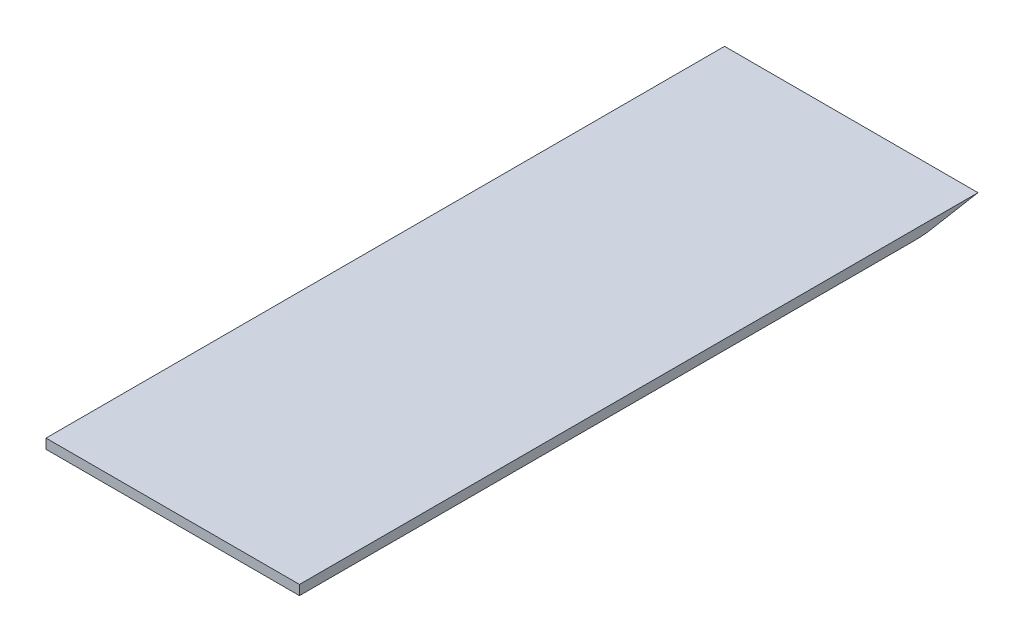
ISO-10303-21;
HEADER;
FILE_DESCRIPTION(('STEP AP214'),'2;1');
FILE_NAME('part.step','',(''),(''),'','','');
FILE_SCHEMA(('AUTOMOTIVE_DESIGN { 1 0 10303 214 1 1 1 1 }'));
ENDSEC;
DATA;
#1=APPLICATION_CONTEXT('core data for automotive mechanical design processes');
#2=APPLICATION_PROTOCOL_DEFINITION('international standard','automotive_design',2000,#1);
#3=PRODUCT_CONTEXT('',#1,'mechanical');
#4=PRODUCT('Part','Part','',(#3));
#5=PRODUCT_RELATED_PRODUCT_CATEGORY('part','',(#4));
#6=PRODUCT_DEFINITION_FORMATION('','',#4);
#7=PRODUCT_DEFINITION_CONTEXT('part definition',#1,'design');
#8=PRODUCT_DEFINITION('design','',#6,#7);
#9=PRODUCT_DEFINITION_SHAPE('','',#8);
#10=(LENGTH_UNIT() NAMED_UNIT(*) SI_UNIT(.MILLI.,.METRE.));
#11=(NAMED_UNIT(*) PLANE_ANGLE_UNIT() SI_UNIT($,.RADIAN.));
#12=(NAMED_UNIT(*) SI_UNIT($,.STERADIAN.) SOLID_ANGLE_UNIT());
#13=UNCERTAINTY_MEASURE_WITH_UNIT(LENGTH_MEASURE(1.E-05),#10,'distance_accuracy_value','');
#14=(GEOMETRIC_REPRESENTATION_CONTEXT(3) GLOBAL_UNCERTAINTY_ASSIGNED_CONTEXT((#13)) GLOBAL_UNIT_ASSIGNED_CONTEXT((#10,
#11,#12)) REPRESENTATION_CONTEXT('',''));
#15=CARTESIAN_POINT('',(0.,0.,0.));
#16=DIRECTION('',(0.,0.,1.));
#17=DIRECTION('',(1.,0.,0.));
#18=AXIS2_PLACEMENT_3D('',#15,#16,#17);
#19=CARTESIAN_POINT('',(130.,5.,0.));
#20=DIRECTION('',(0.,1.,0.));
#21=DIRECTION('',(0.,0.,1.));
#22=AXIS2_PLACEMENT_3D('',#19,#20,#21);
#23=PLANE('',#22);
#24=DIRECTION('',(0.,0.,-1.));
#25=VECTOR('',#24,1.);
#26=CARTESIAN_POINT('',(0.,5.,0.));
#27=LINE('',#26,#25);
#28=CARTESIAN_POINT('',(0.,5.,0.));
#29=VERTEX_POINT('',#28);
#30=CARTESIAN_POINT('',(0.,5.,-348.));
#31=VERTEX_POINT('',#30);
#32=EDGE_CURVE('E116',#29,#31,#27,.T.);
#33=ORIENTED_EDGE('',*,*,#32,.F.);
#34=DIRECTION('',(-1.,0.,0.));
#35=VECTOR('',#34,1.);
#36=CARTESIAN_POINT('',(130.,5.,0.));
#37=LINE('',#36,#35);
#38=CARTESIAN_POINT('',(130.,5.,0.));
#39=VERTEX_POINT('',#38);
#40=EDGE_CURVE('E107',#39,#29,#37,.T.);
#41=ORIENTED_EDGE('',*,*,#40,.F.);
#42=DIRECTION('',(0.,0.,-1.));
#43=VECTOR('',#42,1.);
#44=CARTESIAN_POINT('',(130.,5.,0.));
#45=LINE('',#44,#43);
#46=CARTESIAN_POINT('',(130.,5.,-348.));
#47=VERTEX_POINT('',#46);
#48=EDGE_CURVE('E90',#39,#47,#45,.T.);
#49=ORIENTED_EDGE('',*,*,#48,.T.);
#50=DIRECTION('',(-1.,0.,0.));
#51=VECTOR('',#50,1.);
#52=CARTESIAN_POINT('',(130.,5.,-348.));
#53=LINE('',#52,#51);
#54=EDGE_CURVE('E98',#47,#31,#53,.T.);
#55=ORIENTED_EDGE('',*,*,#54,.T.);
#56=EDGE_LOOP('',(#33,#41,#49,#55));
#57=FACE_BOUND('',#56,.T.);
#58=ADVANCED_FACE('F39',(#57),#23,.T.);
#59=CARTESIAN_POINT('',(130.,5.,0.));
#60=DIRECTION('',(0.,0.,-1.));
#61=DIRECTION('',(0.,1.,0.));
#62=AXIS2_PLACEMENT_3D('',#59,#60,#61);
#63=PLANE('',#62);
#64=DIRECTION('',(0.,-1.,0.));
#65=VECTOR('',#64,1.);
#66=CARTESIAN_POINT('',(0.,5.,0.));
#67=LINE('',#66,#65);
#68=CARTESIAN_POINT('',(0.,0.,0.));
#69=VERTEX_POINT('',#68);
#70=EDGE_CURVE('E109',#29,#69,#67,.T.);
#71=ORIENTED_EDGE('',*,*,#70,.T.);
#72=DIRECTION('',(-1.,0.,0.));
#73=VECTOR('',#72,1.);
#74=CARTESIAN_POINT('',(130.,0.,0.));
#75=LINE('',#74,#73);
#76=CARTESIAN_POINT('',(130.,0.,0.));
#77=VERTEX_POINT('',#76);
#78=EDGE_CURVE('E104',#77,#69,#75,.T.);
#79=ORIENTED_EDGE('',*,*,#78,.F.);
#80=DIRECTION('',(0.,-1.,0.));
#81=VECTOR('',#80,1.);
#82=CARTESIAN_POINT('',(130.,5.,0.));
#83=LINE('',#82,#81);
#84=EDGE_CURVE('E105',#39,#77,#83,.T.);
#85=ORIENTED_EDGE('',*,*,#84,.F.);
#86=ORIENTED_EDGE('',*,*,#40,.T.);
#87=EDGE_LOOP('',(#71,#79,#85,#86));
#88=FACE_BOUND('',#87,.T.);
#89=ADVANCED_FACE('F130',(#88),#63,.F.);
#90=CARTESIAN_POINT('',(130.,0.,0.));
#91=DIRECTION('',(0.,1.,0.));
#92=DIRECTION('',(0.,0.,1.));
#93=AXIS2_PLACEMENT_3D('',#90,#91,#92);
#94=PLANE('',#93);
#95=DIRECTION('',(0.,0.,-1.));
#96=VECTOR('',#95,1.);
#97=CARTESIAN_POINT('',(0.,0.,0.));
#98=LINE('',#97,#96);
#99=CARTESIAN_POINT('',(0.,0.,-315.570746933442));
#100=VERTEX_POINT('',#99);
#101=EDGE_CURVE('E111',#69,#100,#98,.T.);
#102=ORIENTED_EDGE('',*,*,#101,.T.);
#103=DIRECTION('',(-1.,0.,0.));
#104=VECTOR('',#103,1.);
#105=CARTESIAN_POINT('',(130.,0.,-315.570746933442));
#106=LINE('',#105,#104);
#107=CARTESIAN_POINT('',(130.,0.,-315.570746933442));
#108=VERTEX_POINT('',#107);
#109=EDGE_CURVE('E47',#100,#108,#106,.F.);
#110=ORIENTED_EDGE('',*,*,#109,.T.);
#111=DIRECTION('',(0.,0.,-1.));
#112=VECTOR('',#111,1.);
#113=CARTESIAN_POINT('',(130.,0.,0.));
#114=LINE('',#113,#112);
#115=EDGE_CURVE('E95',#77,#108,#114,.T.);
#116=ORIENTED_EDGE('',*,*,#115,.F.);
#117=ORIENTED_EDGE('',*,*,#78,.T.);
#118=EDGE_LOOP('',(#102,#110,#116,#117));
#119=FACE_BOUND('',#118,.T.);
#120=ADVANCED_FACE('F131',(#119),#94,.F.);
#121=CARTESIAN_POINT('',(130.,0.,-320.));
#122=DIRECTION('',(0.,0.984427575508482,0.175790638483657));
#123=DIRECTION('',(0.,-0.175790638483657,0.984427575508482));
#124=AXIS2_PLACEMENT_3D('',#121,#122,#123);
#125=PLANE('',#124);
#126=DIRECTION('',(0.,0.175790638483657,-0.984427575508482));
#127=VECTOR('',#126,1.);
#128=CARTESIAN_POINT('',(130.,0.,-320.));
#129=LINE('',#128,#127);
#130=CARTESIAN_POINT('',(130.,0.778621224575906,-324.360278857625));
#131=VERTEX_POINT('',#130);
#132=EDGE_CURVE('E86',#131,#47,#129,.T.);
#133=ORIENTED_EDGE('',*,*,#132,.F.);
#134=DIRECTION('',(-1.,0.,0.));
#135=VECTOR('',#134,1.);
#136=CARTESIAN_POINT('',(130.,0.778621224575907,-324.360278857625));
#137=LINE('',#136,#135);
#138=CARTESIAN_POINT('',(0.,0.778621224575906,-324.360278857625));
#139=VERTEX_POINT('',#138);
#140=EDGE_CURVE('E121',#131,#139,#137,.T.);
#141=ORIENTED_EDGE('',*,*,#140,.T.);
#142=DIRECTION('',(0.,0.175790638483657,-0.984427575508482));
#143=VECTOR('',#142,1.);
#144=CARTESIAN_POINT('',(0.,0.,-320.));
#145=LINE('',#144,#143);
#146=EDGE_CURVE('E100',#139,#31,#145,.T.);
#147=ORIENTED_EDGE('',*,*,#146,.T.);
#148=ORIENTED_EDGE('',*,*,#54,.F.);
#149=EDGE_LOOP('',(#133,#141,#147,#148));
#150=FACE_BOUND('',#149,.T.);
#151=ADVANCED_FACE('F99',(#150),#125,.F.);
#152=CARTESIAN_POINT('',(130.,0.,0.));
#153=DIRECTION('',(-1.,0.,0.));
#154=DIRECTION('',(0.,0.,1.));
#155=AXIS2_PLACEMENT_3D('',#152,#153,#154);
#156=PLANE('',#155);
#157=ORIENTED_EDGE('',*,*,#115,.T.);
#158=CARTESIAN_POINT('',(130.,50.,-315.570746933442));
#159=DIRECTION('',(-1.,0.,0.));
#160=DIRECTION('',(0.,0.,1.));
#161=AXIS2_PLACEMENT_3D('',#158,#159,#160);
#162=CIRCLE('',#161,50.);
#163=EDGE_CURVE('E11',#108,#131,#162,.F.);
#164=ORIENTED_EDGE('',*,*,#163,.T.);
#165=ORIENTED_EDGE('',*,*,#132,.T.);
#166=ORIENTED_EDGE('',*,*,#48,.F.);
#167=ORIENTED_EDGE('',*,*,#84,.T.);
#168=EDGE_LOOP('',(#157,#164,#165,#166,#167));
#169=FACE_BOUND('',#168,.T.);
#170=ADVANCED_FACE('F88',(#169),#156,.F.);
#171=CARTESIAN_POINT('',(0.,0.,0.));
#172=DIRECTION('',(-1.,0.,0.));
#173=DIRECTION('',(0.,0.,1.));
#174=AXIS2_PLACEMENT_3D('',#171,#172,#173);
#175=PLANE('',#174);
#176=ORIENTED_EDGE('',*,*,#146,.F.);
#177=CARTESIAN_POINT('',(0.,50.,-315.570746933442));
#178=DIRECTION('',(-1.,0.,0.));
#179=DIRECTION('',(0.,0.,1.));
#180=AXIS2_PLACEMENT_3D('',#177,#178,#179);
#181=CIRCLE('',#180,50.);
#182=EDGE_CURVE('E61',#139,#100,#181,.T.);
#183=ORIENTED_EDGE('',*,*,#182,.T.);
#184=ORIENTED_EDGE('',*,*,#101,.F.);
#185=ORIENTED_EDGE('',*,*,#70,.F.);
#186=ORIENTED_EDGE('',*,*,#32,.T.);
#187=EDGE_LOOP('',(#176,#183,#184,#185,#186));
#188=FACE_BOUND('',#187,.T.);
#189=ADVANCED_FACE('F126',(#188),#175,.T.);
#190=CARTESIAN_POINT('',(130.,50.,-315.570746933442));
#191=DIRECTION('',(-1.,0.,0.));
#192=DIRECTION('',(0.,0.,1.));
#193=AXIS2_PLACEMENT_3D('',#190,#191,#192);
#194=CYLINDRICAL_SURFACE('',#193,50.);
#195=ORIENTED_EDGE('',*,*,#163,.F.);
#196=ORIENTED_EDGE('',*,*,#109,.F.);
#197=ORIENTED_EDGE('',*,*,#182,.F.);
#198=ORIENTED_EDGE('',*,*,#140,.F.);
#199=EDGE_LOOP('',(#195,#196,#197,#198));
#200=FACE_BOUND('',#199,.T.);
#201=ADVANCED_FACE('F41',(#200),#194,.T.);
#202=CLOSED_SHELL('',(#58,#89,#120,#151,#170,#189,#201));
#203=MANIFOLD_SOLID_BREP('B2',#202);
#204=ADVANCED_BREP_SHAPE_REPRESENTATION('',(#18,#203),#14);
#205=SHAPE_DEFINITION_REPRESENTATION(#9,#204);
ENDSEC;
END-ISO-10303-21;
